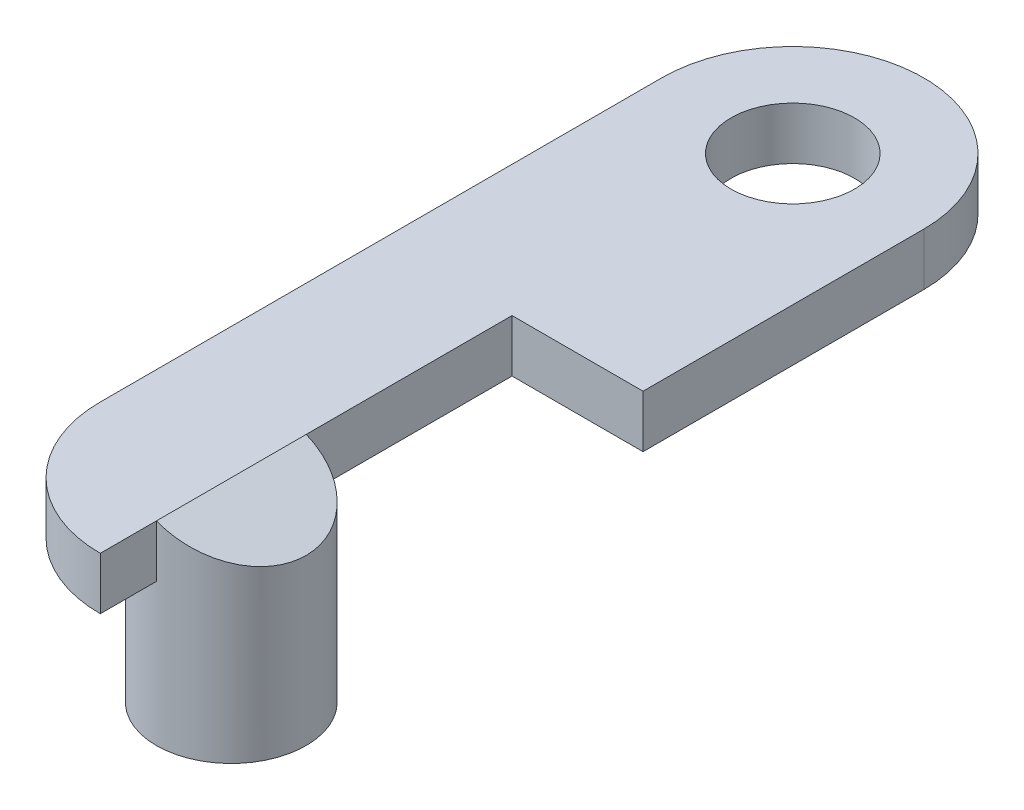
ISO-10303-21;
HEADER;
FILE_DESCRIPTION(('STEP AP214'),'2;1');
FILE_NAME('part.step','',(''),(''),'','','');
FILE_SCHEMA(('AUTOMOTIVE_DESIGN { 1 0 10303 214 1 1 1 1 }'));
ENDSEC;
DATA;
#1=APPLICATION_CONTEXT('core data for automotive mechanical design processes');
#2=APPLICATION_PROTOCOL_DEFINITION('international standard','automotive_design',2000,#1);
#3=PRODUCT_CONTEXT('',#1,'mechanical');
#4=PRODUCT('Part','Part','',(#3));
#5=PRODUCT_RELATED_PRODUCT_CATEGORY('part','',(#4));
#6=PRODUCT_DEFINITION_FORMATION('','',#4);
#7=PRODUCT_DEFINITION_CONTEXT('part definition',#1,'design');
#8=PRODUCT_DEFINITION('design','',#6,#7);
#9=PRODUCT_DEFINITION_SHAPE('','',#8);
#10=(LENGTH_UNIT() NAMED_UNIT(*) SI_UNIT(.MILLI.,.METRE.));
#11=(NAMED_UNIT(*) PLANE_ANGLE_UNIT() SI_UNIT($,.RADIAN.));
#12=(NAMED_UNIT(*) SI_UNIT($,.STERADIAN.) SOLID_ANGLE_UNIT());
#13=UNCERTAINTY_MEASURE_WITH_UNIT(LENGTH_MEASURE(1.E-05),#10,'distance_accuracy_value','');
#14=(GEOMETRIC_REPRESENTATION_CONTEXT(3) GLOBAL_UNCERTAINTY_ASSIGNED_CONTEXT((#13)) GLOBAL_UNIT_ASSIGNED_CONTEXT((#10,
#11,#12)) REPRESENTATION_CONTEXT('',''));
#15=CARTESIAN_POINT('',(0.,0.,0.));
#16=DIRECTION('',(0.,0.,1.));
#17=DIRECTION('',(1.,0.,0.));
#18=AXIS2_PLACEMENT_3D('',#15,#16,#17);
#19=CARTESIAN_POINT('',(0.,3.8,0.));
#20=DIRECTION('',(0.,-1.,0.));
#21=DIRECTION('',(0.,0.,-1.));
#22=AXIS2_PLACEMENT_3D('',#19,#20,#21);
#23=CYLINDRICAL_SURFACE('',#22,2.);
#24=CARTESIAN_POINT('',(0.,0.,0.));
#25=DIRECTION('',(0.,1.,0.));
#26=DIRECTION('',(0.,0.,1.));
#27=AXIS2_PLACEMENT_3D('',#24,#25,#26);
#28=CIRCLE('',#27,2.);
#29=CARTESIAN_POINT('',(0.,0.,2.));
#30=VERTEX_POINT('',#29);
#31=EDGE_CURVE('E39',#30,#30,#28,.T.);
#32=ORIENTED_EDGE('',*,*,#31,.T.);
#33=EDGE_LOOP('',(#32));
#34=FACE_BOUND('',#33,.T.);
#35=CARTESIAN_POINT('',(0.,5.2,0.));
#36=DIRECTION('',(0.371390676354104,0.928476690885259,0.));
#37=DIRECTION('',(0.92847669088526,-0.371390676354104,0.));
#38=AXIS2_PLACEMENT_3D('',#35,#36,#37);
#39=ELLIPSE('',#38,2.1540659228538,2.);
#40=CARTESIAN_POINT('',(0.,5.2,2.));
#41=VERTEX_POINT('',#40);
#42=CARTESIAN_POINT('',(0.,5.2,-2.));
#43=VERTEX_POINT('',#42);
#44=EDGE_CURVE('E112',#41,#43,#39,.T.);
#45=ORIENTED_EDGE('',*,*,#44,.F.);
#46=DIRECTION('',(0.,-1.,0.));
#47=VECTOR('',#46,1.);
#48=CARTESIAN_POINT('',(0.,5.2,2.));
#49=LINE('',#48,#47);
#50=CARTESIAN_POINT('',(0.,3.8,2.));
#51=VERTEX_POINT('',#50);
#52=EDGE_CURVE('E120',#41,#51,#49,.T.);
#53=ORIENTED_EDGE('',*,*,#52,.T.);
#54=CARTESIAN_POINT('',(0.,3.8,0.));
#55=DIRECTION('',(0.,1.,0.));
#56=DIRECTION('',(0.,0.,1.));
#57=AXIS2_PLACEMENT_3D('',#54,#55,#56);
#58=CIRCLE('',#57,2.);
#59=CARTESIAN_POINT('',(0.,3.8,-2.));
#60=VERTEX_POINT('',#59);
#61=EDGE_CURVE('E11',#60,#51,#58,.T.);
#62=ORIENTED_EDGE('',*,*,#61,.F.);
#63=DIRECTION('',(0.,-1.,0.));
#64=VECTOR('',#63,1.);
#65=CARTESIAN_POINT('',(0.,5.2,-2.));
#66=LINE('',#65,#64);
#67=EDGE_CURVE('E122',#43,#60,#66,.T.);
#68=ORIENTED_EDGE('',*,*,#67,.F.);
#69=EDGE_LOOP('',(#45,#53,#62,#68));
#70=FACE_BOUND('',#69,.T.);
#71=ADVANCED_FACE('F36',(#34,#70),#23,.T.);
#72=CARTESIAN_POINT('',(0.,5.2,0.));
#73=DIRECTION('',(0.,1.,0.));
#74=DIRECTION('',(0.,0.,1.));
#75=AXIS2_PLACEMENT_3D('',#72,#73,#74);
#76=PLANE('',#75);
#77=CARTESIAN_POINT('',(0.,5.2,-15.));
#78=DIRECTION('',(0.,1.,0.));
#79=DIRECTION('',(0.,0.,1.));
#80=AXIS2_PLACEMENT_3D('',#77,#78,#79);
#81=CIRCLE('',#80,1.65);
#82=CARTESIAN_POINT('',(0.,5.2,-13.35));
#83=VERTEX_POINT('',#82);
#84=EDGE_CURVE('E154',#83,#83,#81,.T.);
#85=ORIENTED_EDGE('',*,*,#84,.F.);
#86=EDGE_LOOP('',(#85));
#87=FACE_BOUND('',#86,.T.);
#88=DIRECTION('',(0.,0.,-1.));
#89=VECTOR('',#88,1.);
#90=CARTESIAN_POINT('',(0.,5.2,3.5));
#91=LINE('',#90,#89);
#92=CARTESIAN_POINT('',(0.,5.2,3.5));
#93=VERTEX_POINT('',#92);
#94=EDGE_CURVE('E128',#93,#41,#91,.T.);
#95=ORIENTED_EDGE('',*,*,#94,.T.);
#96=DIRECTION('',(0.,0.,-1.));
#97=VECTOR('',#96,1.);
#98=CARTESIAN_POINT('',(0.,5.2,3.5));
#99=LINE('',#98,#97);
#100=EDGE_CURVE('E109',#41,#43,#99,.T.);
#101=ORIENTED_EDGE('',*,*,#100,.T.);
#102=DIRECTION('',(0.,0.,-1.));
#103=VECTOR('',#102,1.);
#104=CARTESIAN_POINT('',(0.,5.2,-2.));
#105=LINE('',#104,#103);
#106=CARTESIAN_POINT('',(0.,5.2,-7.5));
#107=VERTEX_POINT('',#106);
#108=EDGE_CURVE('E136',#43,#107,#105,.T.);
#109=ORIENTED_EDGE('',*,*,#108,.T.);
#110=DIRECTION('',(1.,0.,0.));
#111=VECTOR('',#110,1.);
#112=CARTESIAN_POINT('',(0.,5.2,-7.5));
#113=LINE('',#112,#111);
#114=CARTESIAN_POINT('',(3.5,5.2,-7.5));
#115=VERTEX_POINT('',#114);
#116=EDGE_CURVE('E138',#107,#115,#113,.T.);
#117=ORIENTED_EDGE('',*,*,#116,.T.);
#118=DIRECTION('',(0.,0.,-1.));
#119=VECTOR('',#118,1.);
#120=CARTESIAN_POINT('',(3.5,5.2,0.));
#121=LINE('',#120,#119);
#122=CARTESIAN_POINT('',(3.5,5.2,-15.));
#123=VERTEX_POINT('',#122);
#124=EDGE_CURVE('E81',#115,#123,#121,.T.);
#125=ORIENTED_EDGE('',*,*,#124,.T.);
#126=CARTESIAN_POINT('',(0.,5.2,-15.));
#127=DIRECTION('',(0.,1.,0.));
#128=DIRECTION('',(0.,0.,1.));
#129=AXIS2_PLACEMENT_3D('',#126,#127,#128);
#130=CIRCLE('',#129,3.5);
#131=CARTESIAN_POINT('',(-3.5,5.2,-15.));
#132=VERTEX_POINT('',#131);
#133=EDGE_CURVE('E162',#123,#132,#130,.T.);
#134=ORIENTED_EDGE('',*,*,#133,.T.);
#135=DIRECTION('',(0.,0.,1.));
#136=VECTOR('',#135,1.);
#137=CARTESIAN_POINT('',(-3.5,5.2,0.));
#138=LINE('',#137,#136);
#139=CARTESIAN_POINT('',(-3.5,5.2,0.));
#140=VERTEX_POINT('',#139);
#141=EDGE_CURVE('E59',#132,#140,#138,.T.);
#142=ORIENTED_EDGE('',*,*,#141,.T.);
#143=CARTESIAN_POINT('',(0.,5.2,0.));
#144=DIRECTION('',(0.,1.,0.));
#145=DIRECTION('',(0.,0.,1.));
#146=AXIS2_PLACEMENT_3D('',#143,#144,#145);
#147=CIRCLE('',#146,3.5);
#148=EDGE_CURVE('E135',#140,#93,#147,.T.);
#149=ORIENTED_EDGE('',*,*,#148,.T.);
#150=EDGE_LOOP('',(#95,#101,#109,#117,#125,#134,#142,#149));
#151=FACE_BOUND('',#150,.T.);
#152=ADVANCED_FACE('F133',(#87,#151),#76,.T.);
#153=CARTESIAN_POINT('',(0.,0.,0.));
#154=DIRECTION('',(0.,1.,0.));
#155=DIRECTION('',(0.,0.,1.));
#156=AXIS2_PLACEMENT_3D('',#153,#154,#155);
#157=PLANE('',#156);
#158=ORIENTED_EDGE('',*,*,#31,.F.);
#159=EDGE_LOOP('',(#158));
#160=FACE_BOUND('',#159,.T.);
#161=ADVANCED_FACE('F185',(#160),#157,.F.);
#162=CARTESIAN_POINT('',(0.,3.8,0.));
#163=DIRECTION('',(0.,1.,0.));
#164=DIRECTION('',(0.,0.,1.));
#165=AXIS2_PLACEMENT_3D('',#162,#163,#164);
#166=PLANE('',#165);
#167=DIRECTION('',(0.,0.,-1.));
#168=VECTOR('',#167,1.);
#169=CARTESIAN_POINT('',(3.5,3.8,0.));
#170=LINE('',#169,#168);
#171=CARTESIAN_POINT('',(3.5,3.8,-7.5));
#172=VERTEX_POINT('',#171);
#173=CARTESIAN_POINT('',(3.5,3.8,-15.));
#174=VERTEX_POINT('',#173);
#175=EDGE_CURVE('E168',#172,#174,#170,.T.);
#176=ORIENTED_EDGE('',*,*,#175,.F.);
#177=DIRECTION('',(1.,0.,0.));
#178=VECTOR('',#177,1.);
#179=CARTESIAN_POINT('',(0.,3.8,-7.5));
#180=LINE('',#179,#178);
#181=CARTESIAN_POINT('',(0.,3.8,-7.5));
#182=VERTEX_POINT('',#181);
#183=EDGE_CURVE('E50',#182,#172,#180,.T.);
#184=ORIENTED_EDGE('',*,*,#183,.F.);
#185=DIRECTION('',(0.,0.,-1.));
#186=VECTOR('',#185,1.);
#187=CARTESIAN_POINT('',(0.,3.8,-2.));
#188=LINE('',#187,#186);
#189=EDGE_CURVE('E140',#60,#182,#188,.T.);
#190=ORIENTED_EDGE('',*,*,#189,.F.);
#191=ORIENTED_EDGE('',*,*,#61,.T.);
#192=DIRECTION('',(0.,0.,-1.));
#193=VECTOR('',#192,1.);
#194=CARTESIAN_POINT('',(0.,3.8,3.5));
#195=LINE('',#194,#193);
#196=CARTESIAN_POINT('',(0.,3.8,3.5));
#197=VERTEX_POINT('',#196);
#198=EDGE_CURVE('E124',#197,#51,#195,.T.);
#199=ORIENTED_EDGE('',*,*,#198,.F.);
#200=CARTESIAN_POINT('',(0.,3.8,0.));
#201=DIRECTION('',(0.,1.,0.));
#202=DIRECTION('',(0.,0.,1.));
#203=AXIS2_PLACEMENT_3D('',#200,#201,#202);
#204=CIRCLE('',#203,3.5);
#205=CARTESIAN_POINT('',(-3.5,3.8,0.));
#206=VERTEX_POINT('',#205);
#207=EDGE_CURVE('E157',#206,#197,#204,.T.);
#208=ORIENTED_EDGE('',*,*,#207,.F.);
#209=DIRECTION('',(0.,0.,1.));
#210=VECTOR('',#209,1.);
#211=CARTESIAN_POINT('',(-3.5,3.8,0.));
#212=LINE('',#211,#210);
#213=CARTESIAN_POINT('',(-3.5,3.8,-15.));
#214=VERTEX_POINT('',#213);
#215=EDGE_CURVE('E76',#214,#206,#212,.T.);
#216=ORIENTED_EDGE('',*,*,#215,.F.);
#217=CARTESIAN_POINT('',(0.,3.8,-15.));
#218=DIRECTION('',(0.,1.,0.));
#219=DIRECTION('',(0.,0.,1.));
#220=AXIS2_PLACEMENT_3D('',#217,#218,#219);
#221=CIRCLE('',#220,3.5);
#222=EDGE_CURVE('E170',#174,#214,#221,.T.);
#223=ORIENTED_EDGE('',*,*,#222,.F.);
#224=EDGE_LOOP('',(#176,#184,#190,#191,#199,#208,#216,#223));
#225=FACE_BOUND('',#224,.T.);
#226=CARTESIAN_POINT('',(0.,3.8,-15.));
#227=DIRECTION('',(0.,1.,0.));
#228=DIRECTION('',(0.,0.,1.));
#229=AXIS2_PLACEMENT_3D('',#226,#227,#228);
#230=CIRCLE('',#229,1.65);
#231=CARTESIAN_POINT('',(0.,3.8,-13.35));
#232=VERTEX_POINT('',#231);
#233=EDGE_CURVE('E149',#232,#232,#230,.T.);
#234=ORIENTED_EDGE('',*,*,#233,.T.);
#235=EDGE_LOOP('',(#234));
#236=FACE_BOUND('',#235,.T.);
#237=ADVANCED_FACE('F187',(#225,#236),#166,.F.);
#238=CARTESIAN_POINT('',(0.,5.2,0.));
#239=DIRECTION('',(0.,-1.,0.));
#240=DIRECTION('',(0.,0.,-1.));
#241=AXIS2_PLACEMENT_3D('',#238,#239,#240);
#242=CYLINDRICAL_SURFACE('',#241,3.5);
#243=ORIENTED_EDGE('',*,*,#207,.T.);
#244=DIRECTION('',(0.,-1.,0.));
#245=VECTOR('',#244,1.);
#246=CARTESIAN_POINT('',(0.,5.2,3.5));
#247=LINE('',#246,#245);
#248=EDGE_CURVE('E131',#93,#197,#247,.T.);
#249=ORIENTED_EDGE('',*,*,#248,.F.);
#250=ORIENTED_EDGE('',*,*,#148,.F.);
#251=DIRECTION('',(0.,-1.,0.));
#252=VECTOR('',#251,1.);
#253=CARTESIAN_POINT('',(-3.5,5.2,0.));
#254=LINE('',#253,#252);
#255=EDGE_CURVE('E165',#140,#206,#254,.T.);
#256=ORIENTED_EDGE('',*,*,#255,.T.);
#257=EDGE_LOOP('',(#243,#249,#250,#256));
#258=FACE_BOUND('',#257,.T.);
#259=ADVANCED_FACE('F192',(#258),#242,.T.);
#260=CARTESIAN_POINT('',(3.5,5.2,0.));
#261=DIRECTION('',(-1.,0.,0.));
#262=DIRECTION('',(0.,0.,1.));
#263=AXIS2_PLACEMENT_3D('',#260,#261,#262);
#264=PLANE('',#263);
#265=ORIENTED_EDGE('',*,*,#124,.F.);
#266=DIRECTION('',(0.,-1.,0.));
#267=VECTOR('',#266,1.);
#268=CARTESIAN_POINT('',(3.5,5.2,-7.5));
#269=LINE('',#268,#267);
#270=EDGE_CURVE('E147',#115,#172,#269,.T.);
#271=ORIENTED_EDGE('',*,*,#270,.T.);
#272=ORIENTED_EDGE('',*,*,#175,.T.);
#273=DIRECTION('',(0.,-1.,0.));
#274=VECTOR('',#273,1.);
#275=CARTESIAN_POINT('',(3.5,5.2,-15.));
#276=LINE('',#275,#274);
#277=EDGE_CURVE('E176',#123,#174,#276,.T.);
#278=ORIENTED_EDGE('',*,*,#277,.F.);
#279=EDGE_LOOP('',(#265,#271,#272,#278));
#280=FACE_BOUND('',#279,.T.);
#281=ADVANCED_FACE('F271',(#280),#264,.F.);
#282=CARTESIAN_POINT('',(0.,5.2,-15.));
#283=DIRECTION('',(0.,-1.,0.));
#284=DIRECTION('',(0.,0.,-1.));
#285=AXIS2_PLACEMENT_3D('',#282,#283,#284);
#286=CYLINDRICAL_SURFACE('',#285,3.5);
#287=ORIENTED_EDGE('',*,*,#222,.T.);
#288=DIRECTION('',(0.,-1.,0.));
#289=VECTOR('',#288,1.);
#290=CARTESIAN_POINT('',(-3.5,5.2,-15.));
#291=LINE('',#290,#289);
#292=EDGE_CURVE('E174',#132,#214,#291,.T.);
#293=ORIENTED_EDGE('',*,*,#292,.F.);
#294=ORIENTED_EDGE('',*,*,#133,.F.);
#295=ORIENTED_EDGE('',*,*,#277,.T.);
#296=EDGE_LOOP('',(#287,#293,#294,#295));
#297=FACE_BOUND('',#296,.T.);
#298=ADVANCED_FACE('F268',(#297),#286,.T.);
#299=CARTESIAN_POINT('',(-3.5,5.2,0.));
#300=DIRECTION('',(1.,0.,0.));
#301=DIRECTION('',(0.,0.,-1.));
#302=AXIS2_PLACEMENT_3D('',#299,#300,#301);
#303=PLANE('',#302);
#304=ORIENTED_EDGE('',*,*,#215,.T.);
#305=ORIENTED_EDGE('',*,*,#255,.F.);
#306=ORIENTED_EDGE('',*,*,#141,.F.);
#307=ORIENTED_EDGE('',*,*,#292,.T.);
#308=EDGE_LOOP('',(#304,#305,#306,#307));
#309=FACE_BOUND('',#308,.T.);
#310=ADVANCED_FACE('F263',(#309),#303,.F.);
#311=CARTESIAN_POINT('',(0.,5.2,-15.));
#312=DIRECTION('',(0.,-1.,0.));
#313=DIRECTION('',(0.,0.,-1.));
#314=AXIS2_PLACEMENT_3D('',#311,#312,#313);
#315=CYLINDRICAL_SURFACE('',#314,1.65);
#316=ORIENTED_EDGE('',*,*,#84,.T.);
#317=EDGE_LOOP('',(#316));
#318=FACE_BOUND('',#317,.T.);
#319=ORIENTED_EDGE('',*,*,#233,.F.);
#320=EDGE_LOOP('',(#319));
#321=FACE_BOUND('',#320,.T.);
#322=ADVANCED_FACE('F218',(#318,#321),#315,.F.);
#323=CARTESIAN_POINT('',(0.,5.2,-7.5));
#324=DIRECTION('',(0.,0.,-1.));
#325=DIRECTION('',(-1.,0.,0.));
#326=AXIS2_PLACEMENT_3D('',#323,#324,#325);
#327=PLANE('',#326);
#328=ORIENTED_EDGE('',*,*,#116,.F.);
#329=DIRECTION('',(0.,-1.,0.));
#330=VECTOR('',#329,1.);
#331=CARTESIAN_POINT('',(0.,5.2,-7.5));
#332=LINE('',#331,#330);
#333=EDGE_CURVE('E150',#107,#182,#332,.T.);
#334=ORIENTED_EDGE('',*,*,#333,.T.);
#335=ORIENTED_EDGE('',*,*,#183,.T.);
#336=ORIENTED_EDGE('',*,*,#270,.F.);
#337=EDGE_LOOP('',(#328,#334,#335,#336));
#338=FACE_BOUND('',#337,.T.);
#339=ADVANCED_FACE('F212',(#338),#327,.F.);
#340=CARTESIAN_POINT('',(0.,5.2,-2.));
#341=DIRECTION('',(-1.,0.,0.));
#342=DIRECTION('',(0.,0.,1.));
#343=AXIS2_PLACEMENT_3D('',#340,#341,#342);
#344=PLANE('',#343);
#345=ORIENTED_EDGE('',*,*,#189,.T.);
#346=ORIENTED_EDGE('',*,*,#333,.F.);
#347=ORIENTED_EDGE('',*,*,#108,.F.);
#348=ORIENTED_EDGE('',*,*,#67,.T.);
#349=EDGE_LOOP('',(#345,#346,#347,#348));
#350=FACE_BOUND('',#349,.T.);
#351=ADVANCED_FACE('F217',(#350),#344,.F.);
#352=CARTESIAN_POINT('',(0.,5.2,3.5));
#353=DIRECTION('',(-1.,0.,0.));
#354=DIRECTION('',(0.,0.,1.));
#355=AXIS2_PLACEMENT_3D('',#352,#353,#354);
#356=PLANE('',#355);
#357=ORIENTED_EDGE('',*,*,#198,.T.);
#358=ORIENTED_EDGE('',*,*,#52,.F.);
#359=ORIENTED_EDGE('',*,*,#94,.F.);
#360=ORIENTED_EDGE('',*,*,#248,.T.);
#361=EDGE_LOOP('',(#357,#358,#359,#360));
#362=FACE_BOUND('',#361,.T.);
#363=ADVANCED_FACE('F127',(#362),#356,.F.);
#364=CARTESIAN_POINT('',(0.,5.2,3.5));
#365=DIRECTION('',(0.371390676354104,0.928476690885259,0.));
#366=DIRECTION('',(-0.92847669088526,0.371390676354104,0.));
#367=AXIS2_PLACEMENT_3D('',#364,#365,#366);
#368=PLANE('',#367);
#369=ORIENTED_EDGE('',*,*,#44,.T.);
#370=ORIENTED_EDGE('',*,*,#100,.F.);
#371=EDGE_LOOP('',(#369,#370));
#372=FACE_BOUND('',#371,.T.);
#373=ADVANCED_FACE('F111',(#372),#368,.T.);
#374=CLOSED_SHELL('',(#71,#152,#161,#237,#259,#281,#298,#310,#322,#339,#351,#363,#373));
#375=MANIFOLD_SOLID_BREP('B2',#374);
#376=ADVANCED_BREP_SHAPE_REPRESENTATION('',(#18,#375),#14);
#377=SHAPE_DEFINITION_REPRESENTATION(#9,#376);
ENDSEC;
END-ISO-10303-21;
